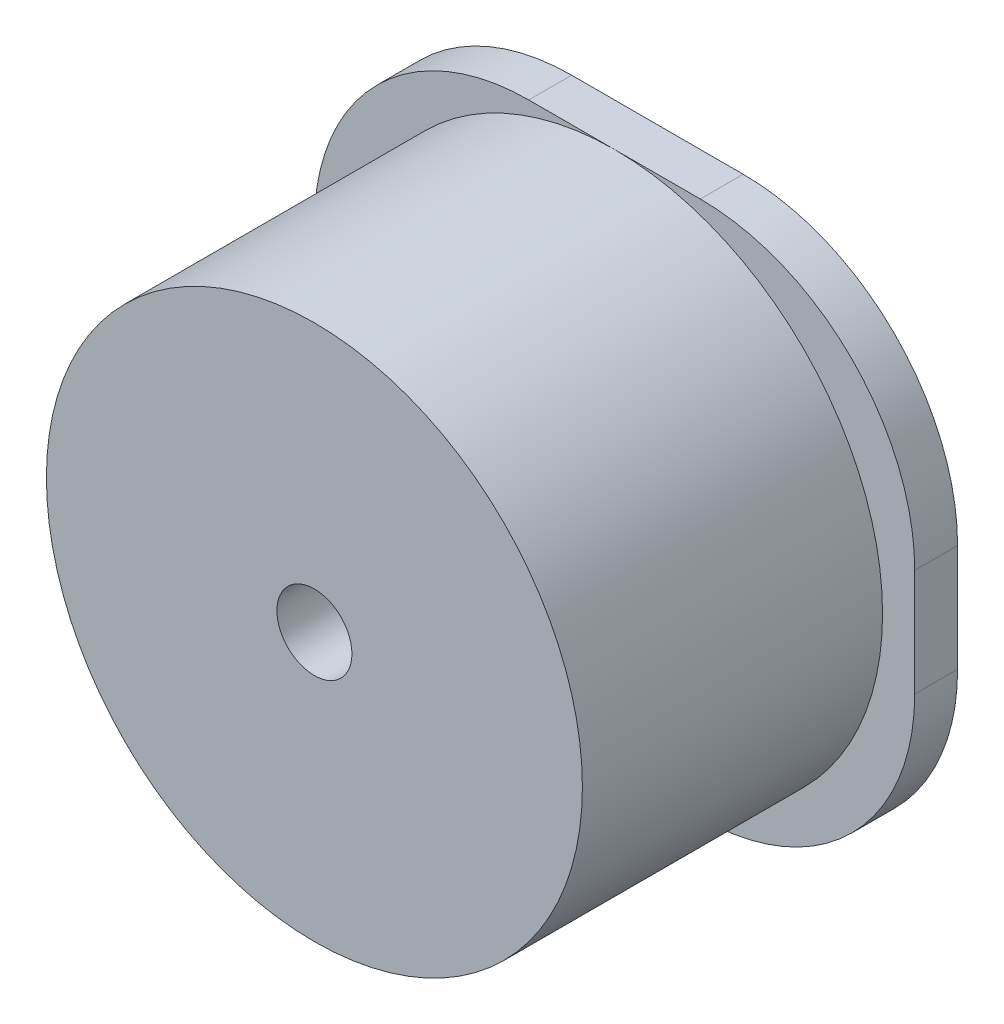
ISO-10303-21;
HEADER;
FILE_DESCRIPTION(('STEP AP214'),'2;1');
FILE_NAME('part.step','',(''),(''),'','','');
FILE_SCHEMA(('AUTOMOTIVE_DESIGN { 1 0 10303 214 1 1 1 1 }'));
ENDSEC;
DATA;
#1=APPLICATION_CONTEXT('core data for automotive mechanical design processes');
#2=APPLICATION_PROTOCOL_DEFINITION('international standard','automotive_design',2000,#1);
#3=PRODUCT_CONTEXT('',#1,'mechanical');
#4=PRODUCT('Part','Part','',(#3));
#5=PRODUCT_RELATED_PRODUCT_CATEGORY('part','',(#4));
#6=PRODUCT_DEFINITION_FORMATION('','',#4);
#7=PRODUCT_DEFINITION_CONTEXT('part definition',#1,'design');
#8=PRODUCT_DEFINITION('design','',#6,#7);
#9=PRODUCT_DEFINITION_SHAPE('','',#8);
#10=(LENGTH_UNIT() NAMED_UNIT(*) SI_UNIT(.MILLI.,.METRE.));
#11=(NAMED_UNIT(*) PLANE_ANGLE_UNIT() SI_UNIT($,.RADIAN.));
#12=(NAMED_UNIT(*) SI_UNIT($,.STERADIAN.) SOLID_ANGLE_UNIT());
#13=UNCERTAINTY_MEASURE_WITH_UNIT(LENGTH_MEASURE(1.E-05),#10,'distance_accuracy_value','');
#14=(GEOMETRIC_REPRESENTATION_CONTEXT(3) GLOBAL_UNCERTAINTY_ASSIGNED_CONTEXT((#13)) GLOBAL_UNIT_ASSIGNED_CONTEXT((#10,
#11,#12)) REPRESENTATION_CONTEXT('',''));
#15=CARTESIAN_POINT('',(0.,0.,0.));
#16=DIRECTION('',(0.,0.,1.));
#17=DIRECTION('',(1.,0.,0.));
#18=AXIS2_PLACEMENT_3D('',#15,#16,#17);
#19=CARTESIAN_POINT('',(0.,0.,14.));
#20=DIRECTION('',(0.,0.,-1.));
#21=DIRECTION('',(-1.,0.,0.));
#22=AXIS2_PLACEMENT_3D('',#19,#20,#21);
#23=CYLINDRICAL_SURFACE('',#22,12.5);
#24=CARTESIAN_POINT('',(0.,0.,14.));
#25=DIRECTION('',(0.,0.,1.));
#26=DIRECTION('',(1.,0.,0.));
#27=AXIS2_PLACEMENT_3D('',#24,#25,#26);
#28=CIRCLE('',#27,12.5);
#29=CARTESIAN_POINT('',(12.5,0.,14.));
#30=VERTEX_POINT('',#29);
#31=EDGE_CURVE('E135',#30,#30,#28,.T.);
#32=ORIENTED_EDGE('',*,*,#31,.F.);
#33=EDGE_LOOP('',(#32));
#34=FACE_BOUND('',#33,.T.);
#35=CARTESIAN_POINT('',(0.,0.,0.));
#36=DIRECTION('',(0.,0.,1.));
#37=DIRECTION('',(1.,0.,0.));
#38=AXIS2_PLACEMENT_3D('',#35,#36,#37);
#39=CIRCLE('',#38,12.5);
#40=CARTESIAN_POINT('',(0.,12.5,0.));
#41=VERTEX_POINT('',#40);
#42=CARTESIAN_POINT('',(0.,-12.5,0.));
#43=VERTEX_POINT('',#42);
#44=EDGE_CURVE('E126',#41,#43,#39,.T.);
#45=ORIENTED_EDGE('',*,*,#44,.T.);
#46=EDGE_CURVE('E120',#43,#41,#39,.T.);
#47=ORIENTED_EDGE('',*,*,#46,.T.);
#48=EDGE_LOOP('',(#45,#47));
#49=FACE_BOUND('',#48,.T.);
#50=ADVANCED_FACE('F37',(#34,#49),#23,.T.);
#51=CARTESIAN_POINT('',(0.,0.,14.));
#52=DIRECTION('',(0.,0.,1.));
#53=DIRECTION('',(1.,0.,0.));
#54=AXIS2_PLACEMENT_3D('',#51,#52,#53);
#55=PLANE('',#54);
#56=CARTESIAN_POINT('',(0.,0.,14.));
#57=DIRECTION('',(0.,0.,1.));
#58=DIRECTION('',(1.,0.,0.));
#59=AXIS2_PLACEMENT_3D('',#56,#57,#58);
#60=CIRCLE('',#59,1.75);
#61=CARTESIAN_POINT('',(1.75,0.,14.));
#62=VERTEX_POINT('',#61);
#63=EDGE_CURVE('E181',#62,#62,#60,.T.);
#64=ORIENTED_EDGE('',*,*,#63,.F.);
#65=EDGE_LOOP('',(#64));
#66=FACE_BOUND('',#65,.T.);
#67=ORIENTED_EDGE('',*,*,#31,.T.);
#68=EDGE_LOOP('',(#67));
#69=FACE_BOUND('',#68,.T.);
#70=ADVANCED_FACE('F202',(#66,#69),#55,.T.);
#71=CARTESIAN_POINT('',(0.,0.,8.));
#72=DIRECTION('',(0.,0.,1.));
#73=DIRECTION('',(1.,0.,0.));
#74=AXIS2_PLACEMENT_3D('',#71,#72,#73);
#75=CYLINDRICAL_SURFACE('',#74,1.75);
#76=CARTESIAN_POINT('',(0.,0.,8.));
#77=DIRECTION('',(0.,0.,1.));
#78=DIRECTION('',(1.,0.,0.));
#79=AXIS2_PLACEMENT_3D('',#76,#77,#78);
#80=CIRCLE('',#79,1.75);
#81=CARTESIAN_POINT('',(1.75,0.,8.));
#82=VERTEX_POINT('',#81);
#83=EDGE_CURVE('E127',#82,#82,#80,.T.);
#84=ORIENTED_EDGE('',*,*,#83,.F.);
#85=EDGE_LOOP('',(#84));
#86=FACE_BOUND('',#85,.T.);
#87=ORIENTED_EDGE('',*,*,#63,.T.);
#88=EDGE_LOOP('',(#87));
#89=FACE_BOUND('',#88,.T.);
#90=ADVANCED_FACE('F200',(#86,#89),#75,.F.);
#91=CARTESIAN_POINT('',(0.,0.,8.));
#92=DIRECTION('',(0.,0.,1.));
#93=DIRECTION('',(1.,0.,0.));
#94=AXIS2_PLACEMENT_3D('',#91,#92,#93);
#95=PLANE('',#94);
#96=ORIENTED_EDGE('',*,*,#83,.T.);
#97=EDGE_LOOP('',(#96));
#98=FACE_BOUND('',#97,.T.);
#99=ADVANCED_FACE('F249',(#98),#95,.T.);
#100=CARTESIAN_POINT('',(0.,0.,0.));
#101=DIRECTION('',(0.,0.,-1.));
#102=DIRECTION('',(-1.,0.,0.));
#103=AXIS2_PLACEMENT_3D('',#100,#101,#102);
#104=PLANE('',#103);
#105=DIRECTION('',(0.,1.,0.));
#106=VECTOR('',#105,1.);
#107=CARTESIAN_POINT('',(-14.,12.5,0.));
#108=LINE('',#107,#106);
#109=CARTESIAN_POINT('',(-14.,-2.5,0.));
#110=VERTEX_POINT('',#109);
#111=CARTESIAN_POINT('',(-14.,2.5,0.));
#112=VERTEX_POINT('',#111);
#113=EDGE_CURVE('E117',#110,#112,#108,.T.);
#114=ORIENTED_EDGE('',*,*,#113,.F.);
#115=CARTESIAN_POINT('',(-4.,-2.5,0.));
#116=DIRECTION('',(0.,0.,-1.));
#117=DIRECTION('',(-1.,0.,0.));
#118=AXIS2_PLACEMENT_3D('',#115,#116,#117);
#119=CIRCLE('',#118,10.);
#120=CARTESIAN_POINT('',(-3.99999999999999,-12.5,0.));
#121=VERTEX_POINT('',#120);
#122=EDGE_CURVE('E133',#110,#121,#119,.F.);
#123=ORIENTED_EDGE('',*,*,#122,.T.);
#124=DIRECTION('',(-1.,0.,0.));
#125=VECTOR('',#124,1.);
#126=CARTESIAN_POINT('',(14.,-12.5,0.));
#127=LINE('',#126,#125);
#128=EDGE_CURVE('E112',#43,#121,#127,.T.);
#129=ORIENTED_EDGE('',*,*,#128,.F.);
#130=ORIENTED_EDGE('',*,*,#44,.F.);
#131=DIRECTION('',(1.,0.,0.));
#132=VECTOR('',#131,1.);
#133=CARTESIAN_POINT('',(14.,12.5,0.));
#134=LINE('',#133,#132);
#135=CARTESIAN_POINT('',(-4.,12.5,0.));
#136=VERTEX_POINT('',#135);
#137=EDGE_CURVE('E194',#136,#41,#134,.T.);
#138=ORIENTED_EDGE('',*,*,#137,.F.);
#139=CARTESIAN_POINT('',(-4.,2.5,0.));
#140=DIRECTION('',(0.,0.,-1.));
#141=DIRECTION('',(-1.,0.,0.));
#142=AXIS2_PLACEMENT_3D('',#139,#140,#141);
#143=CIRCLE('',#142,10.);
#144=EDGE_CURVE('E145',#136,#112,#143,.F.);
#145=ORIENTED_EDGE('',*,*,#144,.T.);
#146=EDGE_LOOP('',(#114,#123,#129,#130,#138,#145));
#147=FACE_BOUND('',#146,.T.);
#148=ADVANCED_FACE('F131',(#147),#104,.F.);
#149=CARTESIAN_POINT('',(14.,12.5,-2.));
#150=DIRECTION('',(-1.,0.,0.));
#151=DIRECTION('',(0.,-1.,0.));
#152=AXIS2_PLACEMENT_3D('',#149,#150,#151);
#153=PLANE('',#152);
#154=DIRECTION('',(0.,-1.,0.));
#155=VECTOR('',#154,1.);
#156=CARTESIAN_POINT('',(14.,12.5,0.));
#157=LINE('',#156,#155);
#158=CARTESIAN_POINT('',(14.,2.5,0.));
#159=VERTEX_POINT('',#158);
#160=CARTESIAN_POINT('',(14.,-2.5,0.));
#161=VERTEX_POINT('',#160);
#162=EDGE_CURVE('E134',#159,#161,#157,.T.);
#163=ORIENTED_EDGE('',*,*,#162,.T.);
#164=DIRECTION('',(0.,0.,1.));
#165=VECTOR('',#164,1.);
#166=CARTESIAN_POINT('',(14.,-2.5,-2.));
#167=LINE('',#166,#165);
#168=CARTESIAN_POINT('',(14.,-2.5,-2.));
#169=VERTEX_POINT('',#168);
#170=EDGE_CURVE('E164',#161,#169,#167,.F.);
#171=ORIENTED_EDGE('',*,*,#170,.T.);
#172=DIRECTION('',(0.,-1.,0.));
#173=VECTOR('',#172,1.);
#174=CARTESIAN_POINT('',(14.,12.5,-2.));
#175=LINE('',#174,#173);
#176=CARTESIAN_POINT('',(14.,2.5,-2.));
#177=VERTEX_POINT('',#176);
#178=EDGE_CURVE('E188',#177,#169,#175,.T.);
#179=ORIENTED_EDGE('',*,*,#178,.F.);
#180=DIRECTION('',(0.,0.,1.));
#181=VECTOR('',#180,1.);
#182=CARTESIAN_POINT('',(14.,2.5,-2.));
#183=LINE('',#182,#181);
#184=EDGE_CURVE('E161',#177,#159,#183,.T.);
#185=ORIENTED_EDGE('',*,*,#184,.T.);
#186=EDGE_LOOP('',(#163,#171,#179,#185));
#187=FACE_BOUND('',#186,.T.);
#188=ADVANCED_FACE('F186',(#187),#153,.F.);
#189=CARTESIAN_POINT('',(14.,-12.5,-2.));
#190=DIRECTION('',(0.,1.,0.));
#191=DIRECTION('',(0.,0.,1.));
#192=AXIS2_PLACEMENT_3D('',#189,#190,#191);
#193=PLANE('',#192);
#194=ORIENTED_EDGE('',*,*,#128,.T.);
#195=DIRECTION('',(0.,0.,1.));
#196=VECTOR('',#195,1.);
#197=CARTESIAN_POINT('',(-4.,-12.5,-2.));
#198=LINE('',#197,#196);
#199=CARTESIAN_POINT('',(-3.99999999999999,-12.5,-2.));
#200=VERTEX_POINT('',#199);
#201=EDGE_CURVE('E149',#121,#200,#198,.F.);
#202=ORIENTED_EDGE('',*,*,#201,.T.);
#203=DIRECTION('',(-1.,0.,0.));
#204=VECTOR('',#203,1.);
#205=CARTESIAN_POINT('',(14.,-12.5,-2.));
#206=LINE('',#205,#204);
#207=CARTESIAN_POINT('',(4.,-12.5,-2.));
#208=VERTEX_POINT('',#207);
#209=EDGE_CURVE('E233',#208,#200,#206,.T.);
#210=ORIENTED_EDGE('',*,*,#209,.F.);
#211=DIRECTION('',(0.,0.,1.));
#212=VECTOR('',#211,1.);
#213=CARTESIAN_POINT('',(4.,-12.5,-2.));
#214=LINE('',#213,#212);
#215=CARTESIAN_POINT('',(4.,-12.5,0.));
#216=VERTEX_POINT('',#215);
#217=EDGE_CURVE('E116',#208,#216,#214,.T.);
#218=ORIENTED_EDGE('',*,*,#217,.T.);
#219=EDGE_CURVE('E108',#216,#43,#127,.T.);
#220=ORIENTED_EDGE('',*,*,#219,.T.);
#221=EDGE_LOOP('',(#194,#202,#210,#218,#220));
#222=FACE_BOUND('',#221,.T.);
#223=ADVANCED_FACE('F110',(#222),#193,.F.);
#224=CARTESIAN_POINT('',(-14.,12.5,-2.));
#225=DIRECTION('',(1.,0.,0.));
#226=DIRECTION('',(0.,1.,0.));
#227=AXIS2_PLACEMENT_3D('',#224,#225,#226);
#228=PLANE('',#227);
#229=DIRECTION('',(0.,1.,0.));
#230=VECTOR('',#229,1.);
#231=CARTESIAN_POINT('',(-14.,12.5,-2.));
#232=LINE('',#231,#230);
#233=CARTESIAN_POINT('',(-14.,-2.5,-2.));
#234=VERTEX_POINT('',#233);
#235=CARTESIAN_POINT('',(-14.,2.5,-2.));
#236=VERTEX_POINT('',#235);
#237=EDGE_CURVE('E182',#234,#236,#232,.T.);
#238=ORIENTED_EDGE('',*,*,#237,.F.);
#239=DIRECTION('',(0.,0.,1.));
#240=VECTOR('',#239,1.);
#241=CARTESIAN_POINT('',(-14.,-2.5,-2.));
#242=LINE('',#241,#240);
#243=EDGE_CURVE('E142',#234,#110,#242,.T.);
#244=ORIENTED_EDGE('',*,*,#243,.T.);
#245=ORIENTED_EDGE('',*,*,#113,.T.);
#246=DIRECTION('',(0.,0.,1.));
#247=VECTOR('',#246,1.);
#248=CARTESIAN_POINT('',(-14.,2.5,-2.));
#249=LINE('',#248,#247);
#250=EDGE_CURVE('E137',#112,#236,#249,.F.);
#251=ORIENTED_EDGE('',*,*,#250,.T.);
#252=EDGE_LOOP('',(#238,#244,#245,#251));
#253=FACE_BOUND('',#252,.T.);
#254=ADVANCED_FACE('F230',(#253),#228,.F.);
#255=CARTESIAN_POINT('',(14.,12.5,-2.));
#256=DIRECTION('',(0.,-1.,0.));
#257=DIRECTION('',(0.,0.,-1.));
#258=AXIS2_PLACEMENT_3D('',#255,#256,#257);
#259=PLANE('',#258);
#260=DIRECTION('',(1.,0.,0.));
#261=VECTOR('',#260,1.);
#262=CARTESIAN_POINT('',(14.,12.5,-2.));
#263=LINE('',#262,#261);
#264=CARTESIAN_POINT('',(-4.,12.5,-2.));
#265=VERTEX_POINT('',#264);
#266=CARTESIAN_POINT('',(4.,12.5,-2.));
#267=VERTEX_POINT('',#266);
#268=EDGE_CURVE('E170',#265,#267,#263,.T.);
#269=ORIENTED_EDGE('',*,*,#268,.F.);
#270=DIRECTION('',(0.,0.,1.));
#271=VECTOR('',#270,1.);
#272=CARTESIAN_POINT('',(-4.,12.5,-2.));
#273=LINE('',#272,#271);
#274=EDGE_CURVE('E11',#265,#136,#273,.T.);
#275=ORIENTED_EDGE('',*,*,#274,.T.);
#276=ORIENTED_EDGE('',*,*,#137,.T.);
#277=CARTESIAN_POINT('',(4.,12.5,0.));
#278=VERTEX_POINT('',#277);
#279=EDGE_CURVE('E122',#41,#278,#134,.T.);
#280=ORIENTED_EDGE('',*,*,#279,.T.);
#281=DIRECTION('',(0.,0.,1.));
#282=VECTOR('',#281,1.);
#283=CARTESIAN_POINT('',(4.,12.5,-2.));
#284=LINE('',#283,#282);
#285=EDGE_CURVE('E45',#278,#267,#284,.F.);
#286=ORIENTED_EDGE('',*,*,#285,.T.);
#287=EDGE_LOOP('',(#269,#275,#276,#280,#286));
#288=FACE_BOUND('',#287,.T.);
#289=ADVANCED_FACE('F169',(#288),#259,.F.);
#290=CARTESIAN_POINT('',(0.,0.,-2.));
#291=DIRECTION('',(0.,0.,-1.));
#292=DIRECTION('',(-1.,0.,0.));
#293=AXIS2_PLACEMENT_3D('',#290,#291,#292);
#294=PLANE('',#293);
#295=ORIENTED_EDGE('',*,*,#209,.T.);
#296=CARTESIAN_POINT('',(-4.,-2.5,-2.));
#297=DIRECTION('',(0.,0.,-1.));
#298=DIRECTION('',(-1.,0.,0.));
#299=AXIS2_PLACEMENT_3D('',#296,#297,#298);
#300=CIRCLE('',#299,10.);
#301=EDGE_CURVE('E157',#200,#234,#300,.T.);
#302=ORIENTED_EDGE('',*,*,#301,.T.);
#303=ORIENTED_EDGE('',*,*,#237,.T.);
#304=CARTESIAN_POINT('',(-4.,2.5,-2.));
#305=DIRECTION('',(0.,0.,-1.));
#306=DIRECTION('',(-1.,0.,0.));
#307=AXIS2_PLACEMENT_3D('',#304,#305,#306);
#308=CIRCLE('',#307,10.);
#309=EDGE_CURVE('E153',#236,#265,#308,.T.);
#310=ORIENTED_EDGE('',*,*,#309,.T.);
#311=ORIENTED_EDGE('',*,*,#268,.T.);
#312=CARTESIAN_POINT('',(4.,2.5,-2.));
#313=DIRECTION('',(0.,0.,-1.));
#314=DIRECTION('',(-1.,0.,0.));
#315=AXIS2_PLACEMENT_3D('',#312,#313,#314);
#316=CIRCLE('',#315,10.);
#317=EDGE_CURVE('E151',#267,#177,#316,.T.);
#318=ORIENTED_EDGE('',*,*,#317,.T.);
#319=ORIENTED_EDGE('',*,*,#178,.T.);
#320=CARTESIAN_POINT('',(4.,-2.5,-2.));
#321=DIRECTION('',(0.,0.,-1.));
#322=DIRECTION('',(-1.,0.,0.));
#323=AXIS2_PLACEMENT_3D('',#320,#321,#322);
#324=CIRCLE('',#323,10.);
#325=EDGE_CURVE('E155',#169,#208,#324,.T.);
#326=ORIENTED_EDGE('',*,*,#325,.T.);
#327=EDGE_LOOP('',(#295,#302,#303,#310,#311,#318,#319,#326));
#328=FACE_BOUND('',#327,.T.);
#329=ADVANCED_FACE('F176',(#328),#294,.T.);
#330=ORIENTED_EDGE('',*,*,#219,.F.);
#331=CARTESIAN_POINT('',(4.,-2.5,0.));
#332=DIRECTION('',(0.,0.,-1.));
#333=DIRECTION('',(-1.,0.,0.));
#334=AXIS2_PLACEMENT_3D('',#331,#332,#333);
#335=CIRCLE('',#334,10.);
#336=EDGE_CURVE('E58',#216,#161,#335,.F.);
#337=ORIENTED_EDGE('',*,*,#336,.T.);
#338=ORIENTED_EDGE('',*,*,#162,.F.);
#339=CARTESIAN_POINT('',(4.,2.5,0.));
#340=DIRECTION('',(0.,0.,-1.));
#341=DIRECTION('',(-1.,0.,0.));
#342=AXIS2_PLACEMENT_3D('',#339,#340,#341);
#343=CIRCLE('',#342,10.);
#344=EDGE_CURVE('E52',#159,#278,#343,.F.);
#345=ORIENTED_EDGE('',*,*,#344,.T.);
#346=ORIENTED_EDGE('',*,*,#279,.F.);
#347=ORIENTED_EDGE('',*,*,#46,.F.);
#348=EDGE_LOOP('',(#330,#337,#338,#345,#346,#347));
#349=FACE_BOUND('',#348,.T.);
#350=ADVANCED_FACE('F121',(#349),#104,.F.);
#351=CARTESIAN_POINT('',(-4.,-2.5,-2.));
#352=DIRECTION('',(0.,0.,1.));
#353=DIRECTION('',(1.,0.,0.));
#354=AXIS2_PLACEMENT_3D('',#351,#352,#353);
#355=CYLINDRICAL_SURFACE('',#354,10.);
#356=ORIENTED_EDGE('',*,*,#301,.F.);
#357=ORIENTED_EDGE('',*,*,#201,.F.);
#358=ORIENTED_EDGE('',*,*,#122,.F.);
#359=ORIENTED_EDGE('',*,*,#243,.F.);
#360=EDGE_LOOP('',(#356,#357,#358,#359));
#361=FACE_BOUND('',#360,.T.);
#362=ADVANCED_FACE('F214',(#361),#355,.T.);
#363=CARTESIAN_POINT('',(4.,-2.5,-2.));
#364=DIRECTION('',(0.,0.,1.));
#365=DIRECTION('',(1.,0.,0.));
#366=AXIS2_PLACEMENT_3D('',#363,#364,#365);
#367=CYLINDRICAL_SURFACE('',#366,10.);
#368=ORIENTED_EDGE('',*,*,#325,.F.);
#369=ORIENTED_EDGE('',*,*,#170,.F.);
#370=ORIENTED_EDGE('',*,*,#336,.F.);
#371=ORIENTED_EDGE('',*,*,#217,.F.);
#372=EDGE_LOOP('',(#368,#369,#370,#371));
#373=FACE_BOUND('',#372,.T.);
#374=ADVANCED_FACE('F217',(#373),#367,.T.);
#375=CARTESIAN_POINT('',(-4.,2.5,-2.));
#376=DIRECTION('',(0.,0.,1.));
#377=DIRECTION('',(1.,0.,0.));
#378=AXIS2_PLACEMENT_3D('',#375,#376,#377);
#379=CYLINDRICAL_SURFACE('',#378,10.);
#380=ORIENTED_EDGE('',*,*,#309,.F.);
#381=ORIENTED_EDGE('',*,*,#250,.F.);
#382=ORIENTED_EDGE('',*,*,#144,.F.);
#383=ORIENTED_EDGE('',*,*,#274,.F.);
#384=EDGE_LOOP('',(#380,#381,#382,#383));
#385=FACE_BOUND('',#384,.T.);
#386=ADVANCED_FACE('F220',(#385),#379,.T.);
#387=CARTESIAN_POINT('',(4.,2.5,-2.));
#388=DIRECTION('',(0.,0.,1.));
#389=DIRECTION('',(1.,0.,0.));
#390=AXIS2_PLACEMENT_3D('',#387,#388,#389);
#391=CYLINDRICAL_SURFACE('',#390,10.);
#392=ORIENTED_EDGE('',*,*,#317,.F.);
#393=ORIENTED_EDGE('',*,*,#285,.F.);
#394=ORIENTED_EDGE('',*,*,#344,.F.);
#395=ORIENTED_EDGE('',*,*,#184,.F.);
#396=EDGE_LOOP('',(#392,#393,#394,#395));
#397=FACE_BOUND('',#396,.T.);
#398=ADVANCED_FACE('F39',(#397),#391,.T.);
#399=CLOSED_SHELL('',(#50,#70,#90,#99,#148,#188,#223,#254,#289,#329,#350,#362,#374,#386,#398));
#400=MANIFOLD_SOLID_BREP('B2',#399);
#401=ADVANCED_BREP_SHAPE_REPRESENTATION('',(#18,#400),#14);
#402=SHAPE_DEFINITION_REPRESENTATION(#9,#401);
ENDSEC;
END-ISO-10303-21;
